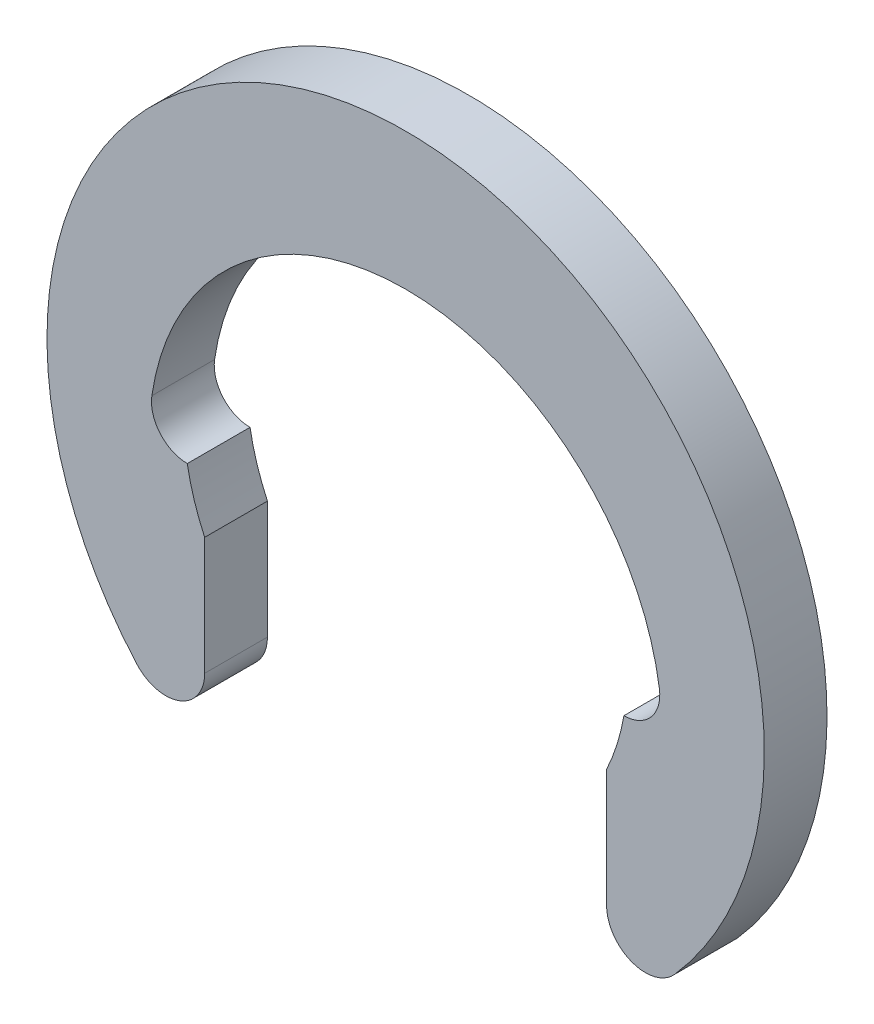
ISO-10303-21;
HEADER;
FILE_DESCRIPTION(('STEP AP214'),'2;1');
FILE_NAME('part.step','',(''),(''),'','','');
FILE_SCHEMA(('AUTOMOTIVE_DESIGN { 1 0 10303 214 1 1 1 1 }'));
ENDSEC;
DATA;
#1=APPLICATION_CONTEXT('core data for automotive mechanical design processes');
#2=APPLICATION_PROTOCOL_DEFINITION('international standard','automotive_design',2000,#1);
#3=PRODUCT_CONTEXT('',#1,'mechanical');
#4=PRODUCT('Part','Part','',(#3));
#5=PRODUCT_RELATED_PRODUCT_CATEGORY('part','',(#4));
#6=PRODUCT_DEFINITION_FORMATION('','',#4);
#7=PRODUCT_DEFINITION_CONTEXT('part definition',#1,'design');
#8=PRODUCT_DEFINITION('design','',#6,#7);
#9=PRODUCT_DEFINITION_SHAPE('','',#8);
#10=(LENGTH_UNIT() NAMED_UNIT(*) SI_UNIT(.MILLI.,.METRE.));
#11=(NAMED_UNIT(*) PLANE_ANGLE_UNIT() SI_UNIT($,.RADIAN.));
#12=(NAMED_UNIT(*) SI_UNIT($,.STERADIAN.) SOLID_ANGLE_UNIT());
#13=UNCERTAINTY_MEASURE_WITH_UNIT(LENGTH_MEASURE(1.E-05),#10,'distance_accuracy_value','');
#14=(GEOMETRIC_REPRESENTATION_CONTEXT(3) GLOBAL_UNCERTAINTY_ASSIGNED_CONTEXT((#13)) GLOBAL_UNIT_ASSIGNED_CONTEXT((#10,
#11,#12)) REPRESENTATION_CONTEXT('',''));
#15=CARTESIAN_POINT('',(0.,0.,0.));
#16=DIRECTION('',(0.,0.,1.));
#17=DIRECTION('',(1.,0.,0.));
#18=AXIS2_PLACEMENT_3D('',#15,#16,#17);
#19=CARTESIAN_POINT('',(0.,0.,-0.381));
#20=DIRECTION('',(0.,0.,1.));
#21=DIRECTION('',(1.,0.,0.));
#22=AXIS2_PLACEMENT_3D('',#19,#20,#21);
#23=CYLINDRICAL_SURFACE('',#22,1.3462);
#24=CARTESIAN_POINT('',(0.,0.,0.));
#25=DIRECTION('',(0.,0.,-1.));
#26=DIRECTION('',(1.,0.,0.));
#27=AXIS2_PLACEMENT_3D('',#24,#25,#26);
#28=CIRCLE('',#27,1.3462);
#29=CARTESIAN_POINT('',(-1.22007154290874,-0.56892870395533,0.));
#30=VERTEX_POINT('',#29);
#31=CARTESIAN_POINT('',(-1.32574819710503,-0.233765176775222,0.));
#32=VERTEX_POINT('',#31);
#33=EDGE_CURVE('E141',#30,#32,#28,.T.);
#34=ORIENTED_EDGE('',*,*,#33,.F.);
#35=DIRECTION('',(0.,0.,1.));
#36=VECTOR('',#35,1.);
#37=CARTESIAN_POINT('',(-1.22007154290874,-0.56892870395533,-0.381));
#38=LINE('',#37,#36);
#39=CARTESIAN_POINT('',(-1.22007154290874,-0.56892870395533,-0.381));
#40=VERTEX_POINT('',#39);
#41=EDGE_CURVE('E11',#40,#30,#38,.T.);
#42=ORIENTED_EDGE('',*,*,#41,.F.);
#43=CARTESIAN_POINT('',(0.,0.,-0.381));
#44=DIRECTION('',(0.,0.,-1.));
#45=DIRECTION('',(1.,0.,0.));
#46=AXIS2_PLACEMENT_3D('',#43,#44,#45);
#47=CIRCLE('',#46,1.3462);
#48=CARTESIAN_POINT('',(-1.32574819710503,-0.233765176775222,-0.381));
#49=VERTEX_POINT('',#48);
#50=EDGE_CURVE('E167',#40,#49,#47,.T.);
#51=ORIENTED_EDGE('',*,*,#50,.T.);
#52=DIRECTION('',(0.,0.,1.));
#53=VECTOR('',#52,1.);
#54=CARTESIAN_POINT('',(-1.32574819710503,-0.233765176775222,-0.381));
#55=LINE('',#54,#53);
#56=EDGE_CURVE('E35',#49,#32,#55,.T.);
#57=ORIENTED_EDGE('',*,*,#56,.T.);
#58=EDGE_LOOP('',(#34,#42,#51,#57));
#59=FACE_BOUND('',#58,.T.);
#60=ADVANCED_FACE('F32',(#59),#23,.F.);
#61=CARTESIAN_POINT('',(-1.22007154290874,-0.56892870395533,-0.381));
#62=DIRECTION('',(1.,0.,0.));
#63=DIRECTION('',(0.,1.,0.));
#64=AXIS2_PLACEMENT_3D('',#61,#62,#63);
#65=PLANE('',#64);
#66=DIRECTION('',(0.,1.,0.));
#67=VECTOR('',#66,1.);
#68=CARTESIAN_POINT('',(-1.22007154290874,-0.56892870395533,0.));
#69=LINE('',#68,#67);
#70=CARTESIAN_POINT('',(-1.22007154290874,-1.28392685509783,0.));
#71=VERTEX_POINT('',#70);
#72=EDGE_CURVE('E165',#71,#30,#69,.T.);
#73=ORIENTED_EDGE('',*,*,#72,.F.);
#74=DIRECTION('',(0.,0.,1.));
#75=VECTOR('',#74,1.);
#76=CARTESIAN_POINT('',(-1.22007154290874,-1.28392685509783,-0.381));
#77=LINE('',#76,#75);
#78=CARTESIAN_POINT('',(-1.22007154290874,-1.28392685509783,-0.381));
#79=VERTEX_POINT('',#78);
#80=EDGE_CURVE('E41',#79,#71,#77,.T.);
#81=ORIENTED_EDGE('',*,*,#80,.F.);
#82=DIRECTION('',(0.,1.,0.));
#83=VECTOR('',#82,1.);
#84=CARTESIAN_POINT('',(-1.22007154290874,-0.56892870395533,-0.381));
#85=LINE('',#84,#83);
#86=EDGE_CURVE('E131',#79,#40,#85,.T.);
#87=ORIENTED_EDGE('',*,*,#86,.T.);
#88=ORIENTED_EDGE('',*,*,#41,.T.);
#89=EDGE_LOOP('',(#73,#81,#87,#88));
#90=FACE_BOUND('',#89,.T.);
#91=ADVANCED_FACE('F183',(#90),#65,.T.);
#92=CARTESIAN_POINT('',(-1.45629154290874,-1.28392685509783,-0.381));
#93=DIRECTION('',(0.,0.,1.));
#94=DIRECTION('',(1.,0.,0.));
#95=AXIS2_PLACEMENT_3D('',#92,#93,#94);
#96=CYLINDRICAL_SURFACE('',#95,0.23622);
#97=CARTESIAN_POINT('',(-1.45629154290874,-1.28392685509783,0.));
#98=DIRECTION('',(0.,0.,1.));
#99=DIRECTION('',(1.,0.,0.));
#100=AXIS2_PLACEMENT_3D('',#97,#98,#99);
#101=CIRCLE('',#100,0.23622);
#102=CARTESIAN_POINT('',(-1.63348077865898,-1.44014421371794,0.));
#103=VERTEX_POINT('',#102);
#104=EDGE_CURVE('E118',#103,#71,#101,.T.);
#105=ORIENTED_EDGE('',*,*,#104,.F.);
#106=DIRECTION('',(0.,0.,1.));
#107=VECTOR('',#106,1.);
#108=CARTESIAN_POINT('',(-1.63348077865898,-1.44014421371794,-0.381));
#109=LINE('',#108,#107);
#110=CARTESIAN_POINT('',(-1.63348077865898,-1.44014421371794,-0.381));
#111=VERTEX_POINT('',#110);
#112=EDGE_CURVE('E113',#111,#103,#109,.T.);
#113=ORIENTED_EDGE('',*,*,#112,.F.);
#114=CARTESIAN_POINT('',(-1.45629154290874,-1.28392685509783,-0.381));
#115=DIRECTION('',(0.,0.,1.));
#116=DIRECTION('',(1.,0.,0.));
#117=AXIS2_PLACEMENT_3D('',#114,#115,#116);
#118=CIRCLE('',#117,0.23622);
#119=EDGE_CURVE('E116',#111,#79,#118,.T.);
#120=ORIENTED_EDGE('',*,*,#119,.T.);
#121=ORIENTED_EDGE('',*,*,#80,.T.);
#122=EDGE_LOOP('',(#105,#113,#120,#121));
#123=FACE_BOUND('',#122,.T.);
#124=ADVANCED_FACE('F115',(#123),#96,.T.);
#125=CARTESIAN_POINT('',(0.,0.,-0.381));
#126=DIRECTION('',(0.,0.,1.));
#127=DIRECTION('',(1.,0.,0.));
#128=AXIS2_PLACEMENT_3D('',#125,#126,#127);
#129=CYLINDRICAL_SURFACE('',#128,2.17767647058824);
#130=CARTESIAN_POINT('',(0.,0.,0.));
#131=DIRECTION('',(0.,0.,1.));
#132=DIRECTION('',(1.,0.,0.));
#133=AXIS2_PLACEMENT_3D('',#130,#131,#132);
#134=CIRCLE('',#133,2.17767647058824);
#135=CARTESIAN_POINT('',(1.63348077865898,-1.44014421371794,0.));
#136=VERTEX_POINT('',#135);
#137=EDGE_CURVE('E162',#136,#103,#134,.T.);
#138=ORIENTED_EDGE('',*,*,#137,.F.);
#139=DIRECTION('',(0.,0.,1.));
#140=VECTOR('',#139,1.);
#141=CARTESIAN_POINT('',(1.63348077865898,-1.44014421371794,-0.381));
#142=LINE('',#141,#140);
#143=CARTESIAN_POINT('',(1.63348077865898,-1.44014421371794,-0.381));
#144=VERTEX_POINT('',#143);
#145=EDGE_CURVE('E123',#144,#136,#142,.T.);
#146=ORIENTED_EDGE('',*,*,#145,.F.);
#147=CARTESIAN_POINT('',(0.,0.,-0.381));
#148=DIRECTION('',(0.,0.,1.));
#149=DIRECTION('',(1.,0.,0.));
#150=AXIS2_PLACEMENT_3D('',#147,#148,#149);
#151=CIRCLE('',#150,2.17767647058824);
#152=EDGE_CURVE('E129',#144,#111,#151,.T.);
#153=ORIENTED_EDGE('',*,*,#152,.T.);
#154=ORIENTED_EDGE('',*,*,#112,.T.);
#155=EDGE_LOOP('',(#138,#146,#153,#154));
#156=FACE_BOUND('',#155,.T.);
#157=ADVANCED_FACE('F133',(#156),#129,.T.);
#158=CARTESIAN_POINT('',(1.45629154290874,-1.28392685509783,-0.381));
#159=DIRECTION('',(0.,0.,1.));
#160=DIRECTION('',(1.,0.,0.));
#161=AXIS2_PLACEMENT_3D('',#158,#159,#160);
#162=CYLINDRICAL_SURFACE('',#161,0.23622);
#163=CARTESIAN_POINT('',(1.45629154290874,-1.28392685509783,0.));
#164=DIRECTION('',(0.,0.,1.));
#165=DIRECTION('',(1.,0.,0.));
#166=AXIS2_PLACEMENT_3D('',#163,#164,#165);
#167=CIRCLE('',#166,0.23622);
#168=CARTESIAN_POINT('',(1.22007154290874,-1.28392685509783,0.));
#169=VERTEX_POINT('',#168);
#170=EDGE_CURVE('E159',#169,#136,#167,.T.);
#171=ORIENTED_EDGE('',*,*,#170,.F.);
#172=DIRECTION('',(0.,0.,1.));
#173=VECTOR('',#172,1.);
#174=CARTESIAN_POINT('',(1.22007154290874,-1.28392685509783,-0.381));
#175=LINE('',#174,#173);
#176=CARTESIAN_POINT('',(1.22007154290874,-1.28392685509783,-0.381));
#177=VERTEX_POINT('',#176);
#178=EDGE_CURVE('E171',#177,#169,#175,.T.);
#179=ORIENTED_EDGE('',*,*,#178,.F.);
#180=CARTESIAN_POINT('',(1.45629154290874,-1.28392685509783,-0.381));
#181=DIRECTION('',(0.,0.,1.));
#182=DIRECTION('',(1.,0.,0.));
#183=AXIS2_PLACEMENT_3D('',#180,#181,#182);
#184=CIRCLE('',#183,0.23622);
#185=EDGE_CURVE('E134',#177,#144,#184,.T.);
#186=ORIENTED_EDGE('',*,*,#185,.T.);
#187=ORIENTED_EDGE('',*,*,#145,.T.);
#188=EDGE_LOOP('',(#171,#179,#186,#187));
#189=FACE_BOUND('',#188,.T.);
#190=ADVANCED_FACE('F196',(#189),#162,.T.);
#191=CARTESIAN_POINT('',(1.22007154290874,-0.56892870395533,-0.381));
#192=DIRECTION('',(-1.,0.,0.));
#193=DIRECTION('',(0.,-1.,0.));
#194=AXIS2_PLACEMENT_3D('',#191,#192,#193);
#195=PLANE('',#194);
#196=DIRECTION('',(0.,-1.,0.));
#197=VECTOR('',#196,1.);
#198=CARTESIAN_POINT('',(1.22007154290874,-0.56892870395533,0.));
#199=LINE('',#198,#197);
#200=CARTESIAN_POINT('',(1.22007154290874,-0.56892870395533,0.));
#201=VERTEX_POINT('',#200);
#202=EDGE_CURVE('E156',#201,#169,#199,.T.);
#203=ORIENTED_EDGE('',*,*,#202,.F.);
#204=DIRECTION('',(0.,0.,1.));
#205=VECTOR('',#204,1.);
#206=CARTESIAN_POINT('',(1.22007154290874,-0.56892870395533,-0.381));
#207=LINE('',#206,#205);
#208=CARTESIAN_POINT('',(1.22007154290874,-0.56892870395533,-0.381));
#209=VERTEX_POINT('',#208);
#210=EDGE_CURVE('E173',#209,#201,#207,.T.);
#211=ORIENTED_EDGE('',*,*,#210,.F.);
#212=DIRECTION('',(0.,-1.,0.));
#213=VECTOR('',#212,1.);
#214=CARTESIAN_POINT('',(1.22007154290874,-0.56892870395533,-0.381));
#215=LINE('',#214,#213);
#216=EDGE_CURVE('E136',#209,#177,#215,.T.);
#217=ORIENTED_EDGE('',*,*,#216,.T.);
#218=ORIENTED_EDGE('',*,*,#178,.T.);
#219=EDGE_LOOP('',(#203,#211,#217,#218));
#220=FACE_BOUND('',#219,.T.);
#221=ADVANCED_FACE('F199',(#220),#195,.T.);
#222=CARTESIAN_POINT('',(0.,0.,-0.381));
#223=DIRECTION('',(0.,0.,1.));
#224=DIRECTION('',(1.,0.,0.));
#225=AXIS2_PLACEMENT_3D('',#222,#223,#224);
#226=CYLINDRICAL_SURFACE('',#225,1.3462);
#227=CARTESIAN_POINT('',(0.,0.,0.));
#228=DIRECTION('',(0.,0.,-1.));
#229=DIRECTION('',(1.,0.,0.));
#230=AXIS2_PLACEMENT_3D('',#227,#228,#229);
#231=CIRCLE('',#230,1.3462);
#232=CARTESIAN_POINT('',(1.32574819710503,-0.233765176775223,0.));
#233=VERTEX_POINT('',#232);
#234=EDGE_CURVE('E153',#233,#201,#231,.T.);
#235=ORIENTED_EDGE('',*,*,#234,.F.);
#236=DIRECTION('',(0.,0.,1.));
#237=VECTOR('',#236,1.);
#238=CARTESIAN_POINT('',(1.32574819710503,-0.233765176775223,-0.381));
#239=LINE('',#238,#237);
#240=CARTESIAN_POINT('',(1.32574819710503,-0.233765176775223,-0.381));
#241=VERTEX_POINT('',#240);
#242=EDGE_CURVE('E175',#241,#233,#239,.T.);
#243=ORIENTED_EDGE('',*,*,#242,.F.);
#244=CARTESIAN_POINT('',(0.,0.,-0.381));
#245=DIRECTION('',(0.,0.,-1.));
#246=DIRECTION('',(1.,0.,0.));
#247=AXIS2_PLACEMENT_3D('',#244,#245,#246);
#248=CIRCLE('',#247,1.3462);
#249=EDGE_CURVE('E298',#241,#209,#248,.T.);
#250=ORIENTED_EDGE('',*,*,#249,.T.);
#251=ORIENTED_EDGE('',*,*,#210,.T.);
#252=EDGE_LOOP('',(#235,#243,#250,#251));
#253=FACE_BOUND('',#252,.T.);
#254=ADVANCED_FACE('F203',(#253),#226,.F.);
#255=CARTESIAN_POINT('',(1.32574819710503,-0.016323457827827,-0.381));
#256=DIRECTION('',(0.,0.,1.));
#257=DIRECTION('',(1.,0.,0.));
#258=AXIS2_PLACEMENT_3D('',#255,#256,#257);
#259=CYLINDRICAL_SURFACE('',#258,0.217441718947395);
#260=CARTESIAN_POINT('',(1.32574819710503,-0.016323457827827,0.));
#261=DIRECTION('',(0.,0.,-1.));
#262=DIRECTION('',(1.,0.,0.));
#263=AXIS2_PLACEMENT_3D('',#260,#261,#262);
#264=CIRCLE('',#263,0.217441718947395);
#265=CARTESIAN_POINT('',(1.5408771779703,0.0153060020264068,0.));
#266=VERTEX_POINT('',#265);
#267=EDGE_CURVE('E150',#266,#233,#264,.T.);
#268=ORIENTED_EDGE('',*,*,#267,.F.);
#269=DIRECTION('',(0.,0.,1.));
#270=VECTOR('',#269,1.);
#271=CARTESIAN_POINT('',(1.5408771779703,0.0153060020264068,-0.381));
#272=LINE('',#271,#270);
#273=CARTESIAN_POINT('',(1.5408771779703,0.0153060020264068,-0.381));
#274=VERTEX_POINT('',#273);
#275=EDGE_CURVE('E177',#274,#266,#272,.T.);
#276=ORIENTED_EDGE('',*,*,#275,.F.);
#277=CARTESIAN_POINT('',(1.32574819710503,-0.016323457827827,-0.381));
#278=DIRECTION('',(0.,0.,-1.));
#279=DIRECTION('',(1.,0.,0.));
#280=AXIS2_PLACEMENT_3D('',#277,#278,#279);
#281=CIRCLE('',#280,0.217441718947395);
#282=EDGE_CURVE('E294',#274,#241,#281,.T.);
#283=ORIENTED_EDGE('',*,*,#282,.T.);
#284=ORIENTED_EDGE('',*,*,#242,.T.);
#285=EDGE_LOOP('',(#268,#276,#283,#284));
#286=FACE_BOUND('',#285,.T.);
#287=ADVANCED_FACE('F207',(#286),#259,.F.);
#288=CARTESIAN_POINT('',(0.,-0.211242334905663,-0.381));
#289=DIRECTION('',(0.,0.,1.));
#290=DIRECTION('',(1.,0.,0.));
#291=AXIS2_PLACEMENT_3D('',#288,#289,#290);
#292=CYLINDRICAL_SURFACE('',#291,1.55744233490566);
#293=CARTESIAN_POINT('',(0.,-0.211242334905663,0.));
#294=DIRECTION('',(0.,0.,-1.));
#295=DIRECTION('',(1.,0.,0.));
#296=AXIS2_PLACEMENT_3D('',#293,#294,#295);
#297=CIRCLE('',#296,1.55744233490566);
#298=CARTESIAN_POINT('',(-1.5408771779703,0.015306002026407,0.));
#299=VERTEX_POINT('',#298);
#300=EDGE_CURVE('E147',#299,#266,#297,.T.);
#301=ORIENTED_EDGE('',*,*,#300,.F.);
#302=DIRECTION('',(0.,0.,1.));
#303=VECTOR('',#302,1.);
#304=CARTESIAN_POINT('',(-1.5408771779703,0.015306002026407,-0.381));
#305=LINE('',#304,#303);
#306=CARTESIAN_POINT('',(-1.5408771779703,0.015306002026407,-0.381));
#307=VERTEX_POINT('',#306);
#308=EDGE_CURVE('E178',#307,#299,#305,.T.);
#309=ORIENTED_EDGE('',*,*,#308,.F.);
#310=CARTESIAN_POINT('',(0.,-0.211242334905663,-0.381));
#311=DIRECTION('',(0.,0.,-1.));
#312=DIRECTION('',(1.,0.,0.));
#313=AXIS2_PLACEMENT_3D('',#310,#311,#312);
#314=CIRCLE('',#313,1.55744233490566);
#315=EDGE_CURVE('E305',#307,#274,#314,.T.);
#316=ORIENTED_EDGE('',*,*,#315,.T.);
#317=ORIENTED_EDGE('',*,*,#275,.T.);
#318=EDGE_LOOP('',(#301,#309,#316,#317));
#319=FACE_BOUND('',#318,.T.);
#320=ADVANCED_FACE('F211',(#319),#292,.F.);
#321=CARTESIAN_POINT('',(-1.32574819710503,-0.016323457827827,-0.381));
#322=DIRECTION('',(0.,0.,1.));
#323=DIRECTION('',(1.,0.,0.));
#324=AXIS2_PLACEMENT_3D('',#321,#322,#323);
#325=CYLINDRICAL_SURFACE('',#324,0.217441718947395);
#326=CARTESIAN_POINT('',(-1.32574819710503,-0.016323457827827,0.));
#327=DIRECTION('',(0.,0.,-1.));
#328=DIRECTION('',(1.,0.,0.));
#329=AXIS2_PLACEMENT_3D('',#326,#327,#328);
#330=CIRCLE('',#329,0.217441718947395);
#331=EDGE_CURVE('E144',#32,#299,#330,.T.);
#332=ORIENTED_EDGE('',*,*,#331,.F.);
#333=ORIENTED_EDGE('',*,*,#56,.F.);
#334=CARTESIAN_POINT('',(-1.32574819710503,-0.016323457827827,-0.381));
#335=DIRECTION('',(0.,0.,-1.));
#336=DIRECTION('',(1.,0.,0.));
#337=AXIS2_PLACEMENT_3D('',#334,#335,#336);
#338=CIRCLE('',#337,0.217441718947395);
#339=EDGE_CURVE('E307',#49,#307,#338,.T.);
#340=ORIENTED_EDGE('',*,*,#339,.T.);
#341=ORIENTED_EDGE('',*,*,#308,.T.);
#342=EDGE_LOOP('',(#332,#333,#340,#341));
#343=FACE_BOUND('',#342,.T.);
#344=ADVANCED_FACE('F180',(#343),#325,.F.);
#345=CARTESIAN_POINT('',(0.,0.,-0.381));
#346=DIRECTION('',(0.,0.,1.));
#347=DIRECTION('',(1.,0.,0.));
#348=AXIS2_PLACEMENT_3D('',#345,#346,#347);
#349=PLANE('',#348);
#350=ORIENTED_EDGE('',*,*,#50,.F.);
#351=ORIENTED_EDGE('',*,*,#86,.F.);
#352=ORIENTED_EDGE('',*,*,#119,.F.);
#353=ORIENTED_EDGE('',*,*,#152,.F.);
#354=ORIENTED_EDGE('',*,*,#185,.F.);
#355=ORIENTED_EDGE('',*,*,#216,.F.);
#356=ORIENTED_EDGE('',*,*,#249,.F.);
#357=ORIENTED_EDGE('',*,*,#282,.F.);
#358=ORIENTED_EDGE('',*,*,#315,.F.);
#359=ORIENTED_EDGE('',*,*,#339,.F.);
#360=EDGE_LOOP('',(#350,#351,#352,#353,#354,#355,#356,#357,#358,#359));
#361=FACE_BOUND('',#360,.T.);
#362=ADVANCED_FACE('F127',(#361),#349,.F.);
#363=CARTESIAN_POINT('',(0.,0.,0.));
#364=DIRECTION('',(0.,0.,1.));
#365=DIRECTION('',(1.,0.,0.));
#366=AXIS2_PLACEMENT_3D('',#363,#364,#365);
#367=PLANE('',#366);
#368=ORIENTED_EDGE('',*,*,#33,.T.);
#369=ORIENTED_EDGE('',*,*,#331,.T.);
#370=ORIENTED_EDGE('',*,*,#300,.T.);
#371=ORIENTED_EDGE('',*,*,#267,.T.);
#372=ORIENTED_EDGE('',*,*,#234,.T.);
#373=ORIENTED_EDGE('',*,*,#202,.T.);
#374=ORIENTED_EDGE('',*,*,#170,.T.);
#375=ORIENTED_EDGE('',*,*,#137,.T.);
#376=ORIENTED_EDGE('',*,*,#104,.T.);
#377=ORIENTED_EDGE('',*,*,#72,.T.);
#378=EDGE_LOOP('',(#368,#369,#370,#371,#372,#373,#374,#375,#376,#377));
#379=FACE_BOUND('',#378,.T.);
#380=ADVANCED_FACE('F182',(#379),#367,.T.);
#381=CLOSED_SHELL('',(#60,#91,#124,#157,#190,#221,#254,#287,#320,#344,#362,#380));
#382=MANIFOLD_SOLID_BREP('B2',#381);
#383=ADVANCED_BREP_SHAPE_REPRESENTATION('',(#18,#382),#14);
#384=SHAPE_DEFINITION_REPRESENTATION(#9,#383);
ENDSEC;
END-ISO-10303-21;
